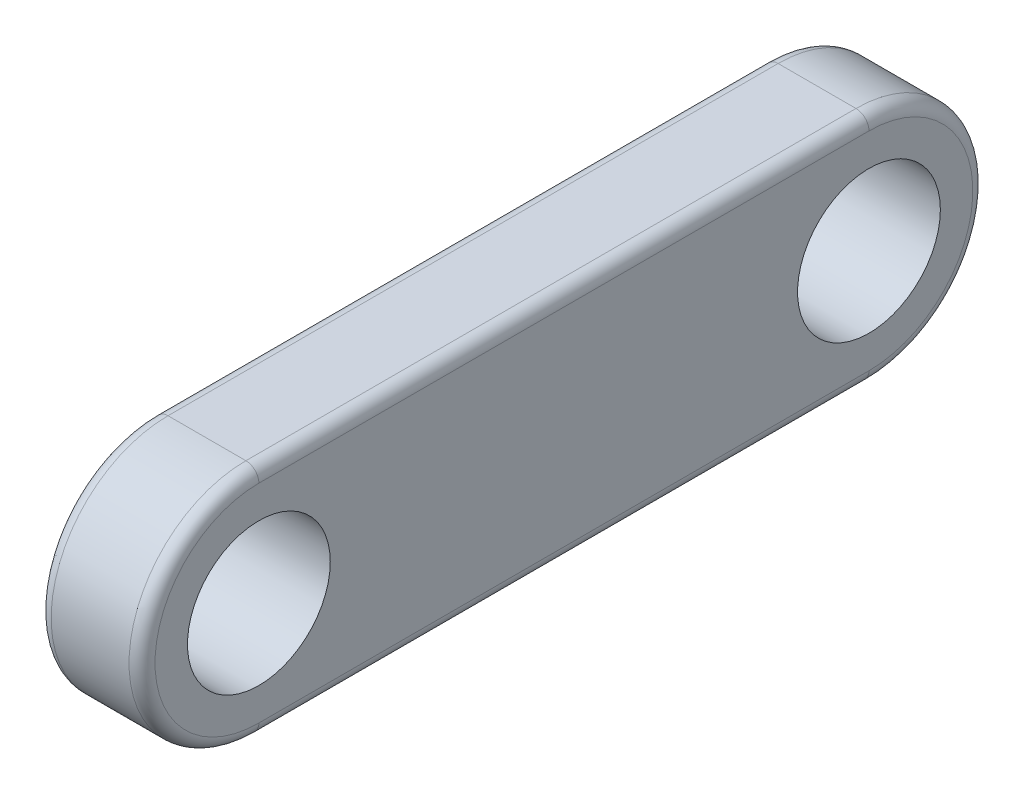
ISO-10303-21;
HEADER;
FILE_DESCRIPTION(('STEP AP214'),'2;1');
FILE_NAME('part.step','',(''),(''),'','','');
FILE_SCHEMA(('AUTOMOTIVE_DESIGN { 1 0 10303 214 1 1 1 1 }'));
ENDSEC;
DATA;
#1=APPLICATION_CONTEXT('core data for automotive mechanical design processes');
#2=APPLICATION_PROTOCOL_DEFINITION('international standard','automotive_design',2000,#1);
#3=PRODUCT_CONTEXT('',#1,'mechanical');
#4=PRODUCT('Part','Part','',(#3));
#5=PRODUCT_RELATED_PRODUCT_CATEGORY('part','',(#4));
#6=PRODUCT_DEFINITION_FORMATION('','',#4);
#7=PRODUCT_DEFINITION_CONTEXT('part definition',#1,'design');
#8=PRODUCT_DEFINITION('design','',#6,#7);
#9=PRODUCT_DEFINITION_SHAPE('','',#8);
#10=(LENGTH_UNIT() NAMED_UNIT(*) SI_UNIT(.MILLI.,.METRE.));
#11=(NAMED_UNIT(*) PLANE_ANGLE_UNIT() SI_UNIT($,.RADIAN.));
#12=(NAMED_UNIT(*) SI_UNIT($,.STERADIAN.) SOLID_ANGLE_UNIT());
#13=UNCERTAINTY_MEASURE_WITH_UNIT(LENGTH_MEASURE(1.E-05),#10,'distance_accuracy_value','');
#14=(GEOMETRIC_REPRESENTATION_CONTEXT(3) GLOBAL_UNCERTAINTY_ASSIGNED_CONTEXT((#13)) GLOBAL_UNIT_ASSIGNED_CONTEXT((#10,
#11,#12)) REPRESENTATION_CONTEXT('',''));
#15=CARTESIAN_POINT('',(0.,0.,0.));
#16=DIRECTION('',(0.,0.,1.));
#17=DIRECTION('',(1.,0.,0.));
#18=AXIS2_PLACEMENT_3D('',#15,#16,#17);
#19=CARTESIAN_POINT('',(2.,-4.5,0.));
#20=DIRECTION('',(0.,1.,0.));
#21=DIRECTION('',(0.,0.,1.));
#22=AXIS2_PLACEMENT_3D('',#19,#20,#21);
#23=PLANE('',#22);
#24=DIRECTION('',(-1.,0.,0.));
#25=VECTOR('',#24,1.);
#26=CARTESIAN_POINT('',(2.,-4.5,28.));
#27=LINE('',#26,#25);
#28=CARTESIAN_POINT('',(1.5,-4.5,28.));
#29=VERTEX_POINT('',#28);
#30=CARTESIAN_POINT('',(-1.5,-4.5,28.));
#31=VERTEX_POINT('',#30);
#32=EDGE_CURVE('E235',#29,#31,#27,.T.);
#33=ORIENTED_EDGE('',*,*,#32,.T.);
#34=DIRECTION('',(0.,0.,-1.));
#35=VECTOR('',#34,1.);
#36=CARTESIAN_POINT('',(-1.5,-4.5,0.));
#37=LINE('',#36,#35);
#38=CARTESIAN_POINT('',(-1.5,-4.5,4.5));
#39=VERTEX_POINT('',#38);
#40=EDGE_CURVE('E11',#31,#39,#37,.T.);
#41=ORIENTED_EDGE('',*,*,#40,.T.);
#42=DIRECTION('',(-1.,0.,0.));
#43=VECTOR('',#42,1.);
#44=CARTESIAN_POINT('',(2.,-4.5,4.5));
#45=LINE('',#44,#43);
#46=CARTESIAN_POINT('',(1.5,-4.5,4.5));
#47=VERTEX_POINT('',#46);
#48=EDGE_CURVE('E135',#47,#39,#45,.T.);
#49=ORIENTED_EDGE('',*,*,#48,.F.);
#50=DIRECTION('',(0.,0.,-1.));
#51=VECTOR('',#50,1.);
#52=CARTESIAN_POINT('',(1.5,-4.5,28.));
#53=LINE('',#52,#51);
#54=EDGE_CURVE('E56',#47,#29,#53,.F.);
#55=ORIENTED_EDGE('',*,*,#54,.T.);
#56=EDGE_LOOP('',(#33,#41,#49,#55));
#57=FACE_BOUND('',#56,.T.);
#58=ADVANCED_FACE('F46',(#57),#23,.F.);
#59=CARTESIAN_POINT('',(2.,0.,4.5));
#60=DIRECTION('',(-1.,0.,0.));
#61=DIRECTION('',(0.,0.,1.));
#62=AXIS2_PLACEMENT_3D('',#59,#60,#61);
#63=CYLINDRICAL_SURFACE('',#62,4.5);
#64=DIRECTION('',(-1.,0.,0.));
#65=VECTOR('',#64,1.);
#66=CARTESIAN_POINT('',(2.,4.5,4.5));
#67=LINE('',#66,#65);
#68=CARTESIAN_POINT('',(1.5,4.5,4.5));
#69=VERTEX_POINT('',#68);
#70=CARTESIAN_POINT('',(-1.5,4.5,4.5));
#71=VERTEX_POINT('',#70);
#72=EDGE_CURVE('E243',#69,#71,#67,.T.);
#73=ORIENTED_EDGE('',*,*,#72,.F.);
#74=CARTESIAN_POINT('',(1.5,0.,4.5));
#75=DIRECTION('',(1.,0.,0.));
#76=DIRECTION('',(0.,0.,-1.));
#77=AXIS2_PLACEMENT_3D('',#74,#75,#76);
#78=CIRCLE('',#77,4.5);
#79=EDGE_CURVE('E163',#69,#47,#78,.F.);
#80=ORIENTED_EDGE('',*,*,#79,.T.);
#81=ORIENTED_EDGE('',*,*,#48,.T.);
#82=CARTESIAN_POINT('',(-1.5,0.,4.5));
#83=DIRECTION('',(1.,0.,0.));
#84=DIRECTION('',(0.,0.,-1.));
#85=AXIS2_PLACEMENT_3D('',#82,#83,#84);
#86=CIRCLE('',#85,4.5);
#87=EDGE_CURVE('E160',#39,#71,#86,.T.);
#88=ORIENTED_EDGE('',*,*,#87,.T.);
#89=EDGE_LOOP('',(#73,#80,#81,#88));
#90=FACE_BOUND('',#89,.T.);
#91=ADVANCED_FACE('F264',(#90),#63,.T.);
#92=CARTESIAN_POINT('',(2.,4.5,0.));
#93=DIRECTION('',(0.,1.,0.));
#94=DIRECTION('',(0.,0.,1.));
#95=AXIS2_PLACEMENT_3D('',#92,#93,#94);
#96=PLANE('',#95);
#97=DIRECTION('',(-1.,0.,0.));
#98=VECTOR('',#97,1.);
#99=CARTESIAN_POINT('',(2.,4.5,28.));
#100=LINE('',#99,#98);
#101=CARTESIAN_POINT('',(1.5,4.5,28.));
#102=VERTEX_POINT('',#101);
#103=CARTESIAN_POINT('',(-1.5,4.5,28.));
#104=VERTEX_POINT('',#103);
#105=EDGE_CURVE('E239',#102,#104,#100,.T.);
#106=ORIENTED_EDGE('',*,*,#105,.F.);
#107=DIRECTION('',(0.,0.,-1.));
#108=VECTOR('',#107,1.);
#109=CARTESIAN_POINT('',(1.5,4.5,0.));
#110=LINE('',#109,#108);
#111=EDGE_CURVE('E157',#102,#69,#110,.T.);
#112=ORIENTED_EDGE('',*,*,#111,.T.);
#113=ORIENTED_EDGE('',*,*,#72,.T.);
#114=DIRECTION('',(0.,0.,-1.));
#115=VECTOR('',#114,1.);
#116=CARTESIAN_POINT('',(-1.5,4.5,28.));
#117=LINE('',#116,#115);
#118=EDGE_CURVE('E154',#71,#104,#117,.F.);
#119=ORIENTED_EDGE('',*,*,#118,.T.);
#120=EDGE_LOOP('',(#106,#112,#113,#119));
#121=FACE_BOUND('',#120,.T.);
#122=ADVANCED_FACE('F262',(#121),#96,.T.);
#123=CARTESIAN_POINT('',(2.,0.,4.5));
#124=DIRECTION('',(-1.,0.,0.));
#125=DIRECTION('',(0.,0.,1.));
#126=AXIS2_PLACEMENT_3D('',#123,#124,#125);
#127=CYLINDRICAL_SURFACE('',#126,2.75);
#128=CARTESIAN_POINT('',(2.,0.,4.5));
#129=DIRECTION('',(1.,0.,0.));
#130=DIRECTION('',(0.,0.,-1.));
#131=AXIS2_PLACEMENT_3D('',#128,#129,#130);
#132=CIRCLE('',#131,2.75);
#133=CARTESIAN_POINT('',(2.,0.,1.75));
#134=VERTEX_POINT('',#133);
#135=EDGE_CURVE('E230',#134,#134,#132,.T.);
#136=ORIENTED_EDGE('',*,*,#135,.T.);
#137=EDGE_LOOP('',(#136));
#138=FACE_BOUND('',#137,.T.);
#139=CARTESIAN_POINT('',(-2.,0.,4.5));
#140=DIRECTION('',(1.,0.,0.));
#141=DIRECTION('',(0.,0.,-1.));
#142=AXIS2_PLACEMENT_3D('',#139,#140,#141);
#143=CIRCLE('',#142,2.75);
#144=CARTESIAN_POINT('',(-2.,0.,1.75));
#145=VERTEX_POINT('',#144);
#146=EDGE_CURVE('E222',#145,#145,#143,.T.);
#147=ORIENTED_EDGE('',*,*,#146,.F.);
#148=EDGE_LOOP('',(#147));
#149=FACE_BOUND('',#148,.T.);
#150=ADVANCED_FACE('F276',(#138,#149),#127,.F.);
#151=CARTESIAN_POINT('',(2.,0.,28.));
#152=DIRECTION('',(-1.,0.,0.));
#153=DIRECTION('',(0.,0.,1.));
#154=AXIS2_PLACEMENT_3D('',#151,#152,#153);
#155=CYLINDRICAL_SURFACE('',#154,2.75);
#156=CARTESIAN_POINT('',(2.,0.,28.));
#157=DIRECTION('',(1.,0.,0.));
#158=DIRECTION('',(0.,0.,-1.));
#159=AXIS2_PLACEMENT_3D('',#156,#157,#158);
#160=CIRCLE('',#159,2.75);
#161=CARTESIAN_POINT('',(2.,0.,25.25));
#162=VERTEX_POINT('',#161);
#163=EDGE_CURVE('E225',#162,#162,#160,.T.);
#164=ORIENTED_EDGE('',*,*,#163,.T.);
#165=EDGE_LOOP('',(#164));
#166=FACE_BOUND('',#165,.T.);
#167=CARTESIAN_POINT('',(-2.,0.,28.));
#168=DIRECTION('',(1.,0.,0.));
#169=DIRECTION('',(0.,0.,-1.));
#170=AXIS2_PLACEMENT_3D('',#167,#168,#169);
#171=CIRCLE('',#170,2.75);
#172=CARTESIAN_POINT('',(-2.,0.,25.25));
#173=VERTEX_POINT('',#172);
#174=EDGE_CURVE('E186',#173,#173,#171,.T.);
#175=ORIENTED_EDGE('',*,*,#174,.F.);
#176=EDGE_LOOP('',(#175));
#177=FACE_BOUND('',#176,.T.);
#178=ADVANCED_FACE('F279',(#166,#177),#155,.F.);
#179=CARTESIAN_POINT('',(2.,0.,28.));
#180=DIRECTION('',(-1.,0.,0.));
#181=DIRECTION('',(0.,0.,1.));
#182=AXIS2_PLACEMENT_3D('',#179,#180,#181);
#183=CYLINDRICAL_SURFACE('',#182,4.5);
#184=ORIENTED_EDGE('',*,*,#32,.F.);
#185=CARTESIAN_POINT('',(1.5,0.,28.));
#186=DIRECTION('',(1.,0.,0.));
#187=DIRECTION('',(0.,0.,-1.));
#188=AXIS2_PLACEMENT_3D('',#185,#186,#187);
#189=CIRCLE('',#188,4.5);
#190=EDGE_CURVE('E120',#29,#102,#189,.F.);
#191=ORIENTED_EDGE('',*,*,#190,.T.);
#192=ORIENTED_EDGE('',*,*,#105,.T.);
#193=CARTESIAN_POINT('',(-1.5,0.,28.));
#194=DIRECTION('',(1.,0.,0.));
#195=DIRECTION('',(0.,0.,-1.));
#196=AXIS2_PLACEMENT_3D('',#193,#194,#195);
#197=CIRCLE('',#196,4.5);
#198=EDGE_CURVE('E143',#104,#31,#197,.T.);
#199=ORIENTED_EDGE('',*,*,#198,.T.);
#200=EDGE_LOOP('',(#184,#191,#192,#199));
#201=FACE_BOUND('',#200,.T.);
#202=ADVANCED_FACE('F261',(#201),#183,.T.);
#203=CARTESIAN_POINT('',(2.,0.,0.));
#204=DIRECTION('',(1.,0.,0.));
#205=DIRECTION('',(0.,0.,-1.));
#206=AXIS2_PLACEMENT_3D('',#203,#204,#205);
#207=PLANE('',#206);
#208=DIRECTION('',(0.,0.,-1.));
#209=VECTOR('',#208,1.);
#210=CARTESIAN_POINT('',(2.,4.,0.));
#211=LINE('',#210,#209);
#212=CARTESIAN_POINT('',(2.,4.,4.5));
#213=VERTEX_POINT('',#212);
#214=CARTESIAN_POINT('',(2.,4.,28.));
#215=VERTEX_POINT('',#214);
#216=EDGE_CURVE('E140',#213,#215,#211,.F.);
#217=ORIENTED_EDGE('',*,*,#216,.T.);
#218=CARTESIAN_POINT('',(2.,0.,28.));
#219=DIRECTION('',(1.,0.,0.));
#220=DIRECTION('',(0.,0.,-1.));
#221=AXIS2_PLACEMENT_3D('',#218,#219,#220);
#222=CIRCLE('',#221,4.);
#223=CARTESIAN_POINT('',(2.,-4.,28.));
#224=VERTEX_POINT('',#223);
#225=EDGE_CURVE('E118',#215,#224,#222,.T.);
#226=ORIENTED_EDGE('',*,*,#225,.T.);
#227=DIRECTION('',(0.,0.,-1.));
#228=VECTOR('',#227,1.);
#229=CARTESIAN_POINT('',(2.,-4.,4.5));
#230=LINE('',#229,#228);
#231=CARTESIAN_POINT('',(2.,-4.,4.5));
#232=VERTEX_POINT('',#231);
#233=EDGE_CURVE('E127',#224,#232,#230,.T.);
#234=ORIENTED_EDGE('',*,*,#233,.T.);
#235=CARTESIAN_POINT('',(2.,0.,4.5));
#236=DIRECTION('',(1.,0.,0.));
#237=DIRECTION('',(0.,0.,-1.));
#238=AXIS2_PLACEMENT_3D('',#235,#236,#237);
#239=CIRCLE('',#238,4.);
#240=EDGE_CURVE('E134',#232,#213,#239,.T.);
#241=ORIENTED_EDGE('',*,*,#240,.T.);
#242=EDGE_LOOP('',(#217,#226,#234,#241));
#243=FACE_BOUND('',#242,.T.);
#244=ORIENTED_EDGE('',*,*,#163,.F.);
#245=EDGE_LOOP('',(#244));
#246=FACE_BOUND('',#245,.T.);
#247=ORIENTED_EDGE('',*,*,#135,.F.);
#248=EDGE_LOOP('',(#247));
#249=FACE_BOUND('',#248,.T.);
#250=ADVANCED_FACE('F137',(#243,#246,#249),#207,.T.);
#251=CARTESIAN_POINT('',(-2.,0.,0.));
#252=DIRECTION('',(1.,0.,0.));
#253=DIRECTION('',(0.,0.,-1.));
#254=AXIS2_PLACEMENT_3D('',#251,#252,#253);
#255=PLANE('',#254);
#256=DIRECTION('',(0.,0.,-1.));
#257=VECTOR('',#256,1.);
#258=CARTESIAN_POINT('',(-2.,-4.,0.));
#259=LINE('',#258,#257);
#260=CARTESIAN_POINT('',(-2.,-4.,4.5));
#261=VERTEX_POINT('',#260);
#262=CARTESIAN_POINT('',(-2.,-4.,28.));
#263=VERTEX_POINT('',#262);
#264=EDGE_CURVE('E64',#261,#263,#259,.F.);
#265=ORIENTED_EDGE('',*,*,#264,.T.);
#266=CARTESIAN_POINT('',(-2.,0.,28.));
#267=DIRECTION('',(1.,0.,0.));
#268=DIRECTION('',(0.,0.,-1.));
#269=AXIS2_PLACEMENT_3D('',#266,#267,#268);
#270=CIRCLE('',#269,4.);
#271=CARTESIAN_POINT('',(-2.,4.,28.));
#272=VERTEX_POINT('',#271);
#273=EDGE_CURVE('E173',#263,#272,#270,.F.);
#274=ORIENTED_EDGE('',*,*,#273,.T.);
#275=DIRECTION('',(0.,0.,-1.));
#276=VECTOR('',#275,1.);
#277=CARTESIAN_POINT('',(-2.,4.,4.5));
#278=LINE('',#277,#276);
#279=CARTESIAN_POINT('',(-2.,4.,4.5));
#280=VERTEX_POINT('',#279);
#281=EDGE_CURVE('E166',#272,#280,#278,.T.);
#282=ORIENTED_EDGE('',*,*,#281,.T.);
#283=CARTESIAN_POINT('',(-2.,0.,4.5));
#284=DIRECTION('',(1.,0.,0.));
#285=DIRECTION('',(0.,0.,-1.));
#286=AXIS2_PLACEMENT_3D('',#283,#284,#285);
#287=CIRCLE('',#286,4.);
#288=EDGE_CURVE('E69',#280,#261,#287,.F.);
#289=ORIENTED_EDGE('',*,*,#288,.T.);
#290=EDGE_LOOP('',(#265,#274,#282,#289));
#291=FACE_BOUND('',#290,.T.);
#292=ORIENTED_EDGE('',*,*,#174,.T.);
#293=EDGE_LOOP('',(#292));
#294=FACE_BOUND('',#293,.T.);
#295=ORIENTED_EDGE('',*,*,#146,.T.);
#296=EDGE_LOOP('',(#295));
#297=FACE_BOUND('',#296,.T.);
#298=ADVANCED_FACE('F212',(#291,#294,#297),#255,.F.);
#299=CARTESIAN_POINT('',(1.5,0.,4.5));
#300=DIRECTION('',(1.,0.,0.));
#301=DIRECTION('',(0.,0.,-1.));
#302=AXIS2_PLACEMENT_3D('',#299,#300,#301);
#303=TOROIDAL_SURFACE('',#302,4.,0.5);
#304=CARTESIAN_POINT('',(1.5,-4.,4.5));
#305=DIRECTION('',(0.,0.,1.));
#306=DIRECTION('',(1.,0.,0.));
#307=AXIS2_PLACEMENT_3D('',#304,#305,#306);
#308=CIRCLE('',#307,0.5);
#309=EDGE_CURVE('E130',#47,#232,#308,.T.);
#310=ORIENTED_EDGE('',*,*,#309,.F.);
#311=ORIENTED_EDGE('',*,*,#79,.F.);
#312=CARTESIAN_POINT('',(1.5,4.,4.5));
#313=DIRECTION('',(0.,0.,1.));
#314=DIRECTION('',(1.,0.,0.));
#315=AXIS2_PLACEMENT_3D('',#312,#313,#314);
#316=CIRCLE('',#315,0.5);
#317=EDGE_CURVE('E182',#213,#69,#316,.T.);
#318=ORIENTED_EDGE('',*,*,#317,.F.);
#319=ORIENTED_EDGE('',*,*,#240,.F.);
#320=EDGE_LOOP('',(#310,#311,#318,#319));
#321=FACE_BOUND('',#320,.T.);
#322=ADVANCED_FACE('F215',(#321),#303,.T.);
#323=CARTESIAN_POINT('',(1.5,4.,0.));
#324=DIRECTION('',(0.,0.,-1.));
#325=DIRECTION('',(0.,1.,0.));
#326=AXIS2_PLACEMENT_3D('',#323,#324,#325);
#327=CYLINDRICAL_SURFACE('',#326,0.5);
#328=ORIENTED_EDGE('',*,*,#317,.T.);
#329=ORIENTED_EDGE('',*,*,#111,.F.);
#330=CARTESIAN_POINT('',(1.5,4.,28.));
#331=DIRECTION('',(0.,0.,1.));
#332=DIRECTION('',(1.,0.,0.));
#333=AXIS2_PLACEMENT_3D('',#330,#331,#332);
#334=CIRCLE('',#333,0.5);
#335=EDGE_CURVE('E124',#215,#102,#334,.T.);
#336=ORIENTED_EDGE('',*,*,#335,.F.);
#337=ORIENTED_EDGE('',*,*,#216,.F.);
#338=EDGE_LOOP('',(#328,#329,#336,#337));
#339=FACE_BOUND('',#338,.T.);
#340=ADVANCED_FACE('F255',(#339),#327,.T.);
#341=CARTESIAN_POINT('',(1.5,-4.,0.));
#342=DIRECTION('',(0.,0.,1.));
#343=DIRECTION('',(0.,-1.,0.));
#344=AXIS2_PLACEMENT_3D('',#341,#342,#343);
#345=CYLINDRICAL_SURFACE('',#344,0.5);
#346=ORIENTED_EDGE('',*,*,#309,.T.);
#347=ORIENTED_EDGE('',*,*,#233,.F.);
#348=CARTESIAN_POINT('',(1.5,-4.,28.));
#349=DIRECTION('',(0.,0.,1.));
#350=DIRECTION('',(1.,0.,0.));
#351=AXIS2_PLACEMENT_3D('',#348,#349,#350);
#352=CIRCLE('',#351,0.5);
#353=EDGE_CURVE('E114',#29,#224,#352,.T.);
#354=ORIENTED_EDGE('',*,*,#353,.F.);
#355=ORIENTED_EDGE('',*,*,#54,.F.);
#356=EDGE_LOOP('',(#346,#347,#354,#355));
#357=FACE_BOUND('',#356,.T.);
#358=ADVANCED_FACE('F128',(#357),#345,.T.);
#359=CARTESIAN_POINT('',(1.5,0.,28.));
#360=DIRECTION('',(1.,0.,0.));
#361=DIRECTION('',(0.,0.,-1.));
#362=AXIS2_PLACEMENT_3D('',#359,#360,#361);
#363=TOROIDAL_SURFACE('',#362,4.,0.5);
#364=ORIENTED_EDGE('',*,*,#335,.T.);
#365=ORIENTED_EDGE('',*,*,#190,.F.);
#366=ORIENTED_EDGE('',*,*,#353,.T.);
#367=ORIENTED_EDGE('',*,*,#225,.F.);
#368=EDGE_LOOP('',(#364,#365,#366,#367));
#369=FACE_BOUND('',#368,.T.);
#370=ADVANCED_FACE('F116',(#369),#363,.T.);
#371=CARTESIAN_POINT('',(-1.5,0.,4.5));
#372=DIRECTION('',(1.,0.,0.));
#373=DIRECTION('',(0.,0.,-1.));
#374=AXIS2_PLACEMENT_3D('',#371,#372,#373);
#375=TOROIDAL_SURFACE('',#374,4.,0.5);
#376=CARTESIAN_POINT('',(-1.5,-4.,4.5));
#377=DIRECTION('',(0.,0.,1.));
#378=DIRECTION('',(1.,0.,0.));
#379=AXIS2_PLACEMENT_3D('',#376,#377,#378);
#380=CIRCLE('',#379,0.5);
#381=EDGE_CURVE('E192',#261,#39,#380,.T.);
#382=ORIENTED_EDGE('',*,*,#381,.F.);
#383=ORIENTED_EDGE('',*,*,#288,.F.);
#384=CARTESIAN_POINT('',(-1.5,4.,4.5));
#385=DIRECTION('',(0.,0.,1.));
#386=DIRECTION('',(1.,0.,0.));
#387=AXIS2_PLACEMENT_3D('',#384,#385,#386);
#388=CIRCLE('',#387,0.5);
#389=EDGE_CURVE('E50',#71,#280,#388,.T.);
#390=ORIENTED_EDGE('',*,*,#389,.F.);
#391=ORIENTED_EDGE('',*,*,#87,.F.);
#392=EDGE_LOOP('',(#382,#383,#390,#391));
#393=FACE_BOUND('',#392,.T.);
#394=ADVANCED_FACE('F48',(#393),#375,.T.);
#395=CARTESIAN_POINT('',(-1.5,4.,0.));
#396=DIRECTION('',(0.,0.,1.));
#397=DIRECTION('',(0.,-1.,0.));
#398=AXIS2_PLACEMENT_3D('',#395,#396,#397);
#399=CYLINDRICAL_SURFACE('',#398,0.5);
#400=ORIENTED_EDGE('',*,*,#389,.T.);
#401=ORIENTED_EDGE('',*,*,#281,.F.);
#402=CARTESIAN_POINT('',(-1.5,4.,28.));
#403=DIRECTION('',(0.,0.,1.));
#404=DIRECTION('',(1.,0.,0.));
#405=AXIS2_PLACEMENT_3D('',#402,#403,#404);
#406=CIRCLE('',#405,0.5);
#407=EDGE_CURVE('E190',#104,#272,#406,.T.);
#408=ORIENTED_EDGE('',*,*,#407,.F.);
#409=ORIENTED_EDGE('',*,*,#118,.F.);
#410=EDGE_LOOP('',(#400,#401,#408,#409));
#411=FACE_BOUND('',#410,.T.);
#412=ADVANCED_FACE('F203',(#411),#399,.T.);
#413=CARTESIAN_POINT('',(-1.5,-4.,0.));
#414=DIRECTION('',(0.,0.,-1.));
#415=DIRECTION('',(0.,1.,0.));
#416=AXIS2_PLACEMENT_3D('',#413,#414,#415);
#417=CYLINDRICAL_SURFACE('',#416,0.5);
#418=ORIENTED_EDGE('',*,*,#381,.T.);
#419=ORIENTED_EDGE('',*,*,#40,.F.);
#420=CARTESIAN_POINT('',(-1.5,-4.,28.));
#421=DIRECTION('',(0.,0.,1.));
#422=DIRECTION('',(1.,0.,0.));
#423=AXIS2_PLACEMENT_3D('',#420,#421,#422);
#424=CIRCLE('',#423,0.5);
#425=EDGE_CURVE('E187',#263,#31,#424,.T.);
#426=ORIENTED_EDGE('',*,*,#425,.F.);
#427=ORIENTED_EDGE('',*,*,#264,.F.);
#428=EDGE_LOOP('',(#418,#419,#426,#427));
#429=FACE_BOUND('',#428,.T.);
#430=ADVANCED_FACE('F208',(#429),#417,.T.);
#431=CARTESIAN_POINT('',(-1.5,0.,28.));
#432=DIRECTION('',(1.,0.,0.));
#433=DIRECTION('',(0.,0.,-1.));
#434=AXIS2_PLACEMENT_3D('',#431,#432,#433);
#435=TOROIDAL_SURFACE('',#434,4.,0.5);
#436=ORIENTED_EDGE('',*,*,#407,.T.);
#437=ORIENTED_EDGE('',*,*,#273,.F.);
#438=ORIENTED_EDGE('',*,*,#425,.T.);
#439=ORIENTED_EDGE('',*,*,#198,.F.);
#440=EDGE_LOOP('',(#436,#437,#438,#439));
#441=FACE_BOUND('',#440,.T.);
#442=ADVANCED_FACE('F211',(#441),#435,.T.);
#443=CLOSED_SHELL('',(#58,#91,#122,#150,#178,#202,#250,#298,#322,#340,#358,#370,#394,#412,#430,#442));
#444=MANIFOLD_SOLID_BREP('B2',#443);
#445=ADVANCED_BREP_SHAPE_REPRESENTATION('',(#18,#444),#14);
#446=SHAPE_DEFINITION_REPRESENTATION(#9,#445);
ENDSEC;
END-ISO-10303-21;
